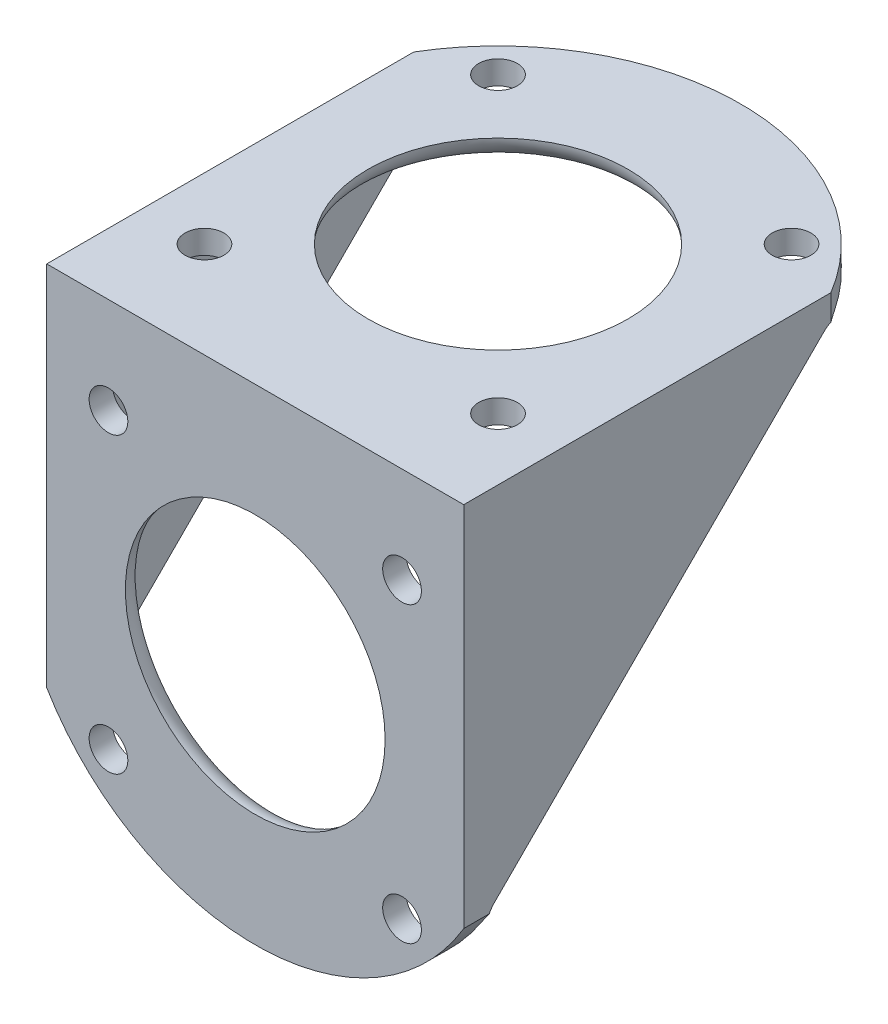
ISO-10303-21;
HEADER;
FILE_DESCRIPTION(('STEP AP214'),'2;1');
FILE_NAME('part.step','',(''),(''),'','','');
FILE_SCHEMA(('AUTOMOTIVE_DESIGN { 1 0 10303 214 1 1 1 1 }'));
ENDSEC;
DATA;
#1=APPLICATION_CONTEXT('core data for automotive mechanical design processes');
#2=APPLICATION_PROTOCOL_DEFINITION('international standard','automotive_design',2000,#1);
#3=PRODUCT_CONTEXT('',#1,'mechanical');
#4=PRODUCT('Part','Part','',(#3));
#5=PRODUCT_RELATED_PRODUCT_CATEGORY('part','',(#4));
#6=PRODUCT_DEFINITION_FORMATION('','',#4);
#7=PRODUCT_DEFINITION_CONTEXT('part definition',#1,'design');
#8=PRODUCT_DEFINITION('design','',#6,#7);
#9=PRODUCT_DEFINITION_SHAPE('','',#8);
#10=(LENGTH_UNIT() NAMED_UNIT(*) SI_UNIT(.MILLI.,.METRE.));
#11=(NAMED_UNIT(*) PLANE_ANGLE_UNIT() SI_UNIT($,.RADIAN.));
#12=(NAMED_UNIT(*) SI_UNIT($,.STERADIAN.) SOLID_ANGLE_UNIT());
#13=UNCERTAINTY_MEASURE_WITH_UNIT(LENGTH_MEASURE(1.E-05),#10,'distance_accuracy_value','');
#14=(GEOMETRIC_REPRESENTATION_CONTEXT(3) GLOBAL_UNCERTAINTY_ASSIGNED_CONTEXT((#13)) GLOBAL_UNIT_ASSIGNED_CONTEXT((#10,
#11,#12)) REPRESENTATION_CONTEXT('',''));
#15=CARTESIAN_POINT('',(0.,0.,0.));
#16=DIRECTION('',(0.,0.,1.));
#17=DIRECTION('',(1.,0.,0.));
#18=AXIS2_PLACEMENT_3D('',#15,#16,#17);
#19=CARTESIAN_POINT('',(0.,0.,0.));
#20=DIRECTION('',(0.,0.,1.));
#21=DIRECTION('',(1.,0.,0.));
#22=AXIS2_PLACEMENT_3D('',#19,#20,#21);
#23=PLANE('',#22);
#24=CARTESIAN_POINT('',(0.,0.,0.));
#25=DIRECTION('',(0.,0.,1.));
#26=DIRECTION('',(1.,0.,0.));
#27=AXIS2_PLACEMENT_3D('',#24,#25,#26);
#28=CIRCLE('',#27,13.07313);
#29=CARTESIAN_POINT('',(13.07313,0.,0.));
#30=VERTEX_POINT('',#29);
#31=EDGE_CURVE('E211',#30,#30,#28,.T.);
#32=ORIENTED_EDGE('',*,*,#31,.T.);
#33=EDGE_LOOP('',(#32));
#34=FACE_BOUND('',#33,.T.);
#35=CARTESIAN_POINT('',(-12.5157900270019,12.5157900270019,0.));
#36=DIRECTION('',(0.,0.,1.));
#37=DIRECTION('',(1.,0.,0.));
#38=AXIS2_PLACEMENT_3D('',#35,#36,#37);
#39=CIRCLE('',#38,1.651);
#40=CARTESIAN_POINT('',(-10.8647900270019,12.5157900270019,0.));
#41=VERTEX_POINT('',#40);
#42=EDGE_CURVE('E169',#41,#41,#39,.T.);
#43=ORIENTED_EDGE('',*,*,#42,.T.);
#44=EDGE_LOOP('',(#43));
#45=FACE_BOUND('',#44,.T.);
#46=CARTESIAN_POINT('',(12.5157900270019,-12.5157900270019,0.));
#47=DIRECTION('',(0.,0.,1.));
#48=DIRECTION('',(1.,0.,0.));
#49=AXIS2_PLACEMENT_3D('',#46,#47,#48);
#50=CIRCLE('',#49,1.651);
#51=CARTESIAN_POINT('',(14.1667900270019,-12.5157900270019,0.));
#52=VERTEX_POINT('',#51);
#53=EDGE_CURVE('E179',#52,#52,#50,.T.);
#54=ORIENTED_EDGE('',*,*,#53,.T.);
#55=EDGE_LOOP('',(#54));
#56=FACE_BOUND('',#55,.T.);
#57=CARTESIAN_POINT('',(-12.5157900270019,-12.5157900270019,0.));
#58=DIRECTION('',(0.,0.,1.));
#59=DIRECTION('',(1.,0.,0.));
#60=AXIS2_PLACEMENT_3D('',#57,#58,#59);
#61=CIRCLE('',#60,1.651);
#62=CARTESIAN_POINT('',(-10.8647900270019,-12.5157900270019,0.));
#63=VERTEX_POINT('',#62);
#64=EDGE_CURVE('E185',#63,#63,#61,.T.);
#65=ORIENTED_EDGE('',*,*,#64,.T.);
#66=EDGE_LOOP('',(#65));
#67=FACE_BOUND('',#66,.T.);
#68=CARTESIAN_POINT('',(12.5157900270019,12.5157900270019,0.));
#69=DIRECTION('',(0.,0.,1.));
#70=DIRECTION('',(1.,0.,0.));
#71=AXIS2_PLACEMENT_3D('',#68,#69,#70);
#72=CIRCLE('',#71,1.651);
#73=CARTESIAN_POINT('',(14.1667900270019,12.5157900270019,0.));
#74=VERTEX_POINT('',#73);
#75=EDGE_CURVE('E173',#74,#74,#72,.T.);
#76=ORIENTED_EDGE('',*,*,#75,.T.);
#77=EDGE_LOOP('',(#76));
#78=FACE_BOUND('',#77,.T.);
#79=DIRECTION('',(0.,1.,0.));
#80=VECTOR('',#79,1.);
#81=CARTESIAN_POINT('',(15.78,18.701,0.));
#82=LINE('',#81,#80);
#83=CARTESIAN_POINT('',(15.78,-11.4304552797739,0.));
#84=VERTEX_POINT('',#83);
#85=CARTESIAN_POINT('',(15.78,18.701,0.));
#86=VERTEX_POINT('',#85);
#87=EDGE_CURVE('E329',#84,#86,#82,.T.);
#88=ORIENTED_EDGE('',*,*,#87,.F.);
#89=DIRECTION('',(1.,0.,0.));
#90=VECTOR('',#89,1.);
#91=CARTESIAN_POINT('',(17.78,-11.4304552797739,0.));
#92=LINE('',#91,#90);
#93=CARTESIAN_POINT('',(17.2590872614136,-11.4304552797739,0.));
#94=VERTEX_POINT('',#93);
#95=EDGE_CURVE('E217',#84,#94,#92,.T.);
#96=ORIENTED_EDGE('',*,*,#95,.T.);
#97=CARTESIAN_POINT('',(0.,0.,0.));
#98=DIRECTION('',(0.,0.,1.));
#99=DIRECTION('',(1.,0.,0.));
#100=AXIS2_PLACEMENT_3D('',#97,#98,#99);
#101=CIRCLE('',#100,20.701);
#102=CARTESIAN_POINT('',(-17.2590872614136,-11.4304552797739,0.));
#103=VERTEX_POINT('',#102);
#104=EDGE_CURVE('E191',#103,#94,#101,.T.);
#105=ORIENTED_EDGE('',*,*,#104,.F.);
#106=DIRECTION('',(-1.,0.,0.));
#107=VECTOR('',#106,1.);
#108=CARTESIAN_POINT('',(0.,-11.4304552797739,0.));
#109=LINE('',#108,#107);
#110=CARTESIAN_POINT('',(-15.78,-11.4304552797739,0.));
#111=VERTEX_POINT('',#110);
#112=EDGE_CURVE('E214',#103,#111,#109,.F.);
#113=ORIENTED_EDGE('',*,*,#112,.T.);
#114=DIRECTION('',(0.,1.,0.));
#115=VECTOR('',#114,1.);
#116=CARTESIAN_POINT('',(-15.78,18.701,0.));
#117=LINE('',#116,#115);
#118=CARTESIAN_POINT('',(-15.78,18.701,0.));
#119=VERTEX_POINT('',#118);
#120=EDGE_CURVE('E312',#111,#119,#117,.T.);
#121=ORIENTED_EDGE('',*,*,#120,.T.);
#122=DIRECTION('',(-1.,0.,0.));
#123=VECTOR('',#122,1.);
#124=CARTESIAN_POINT('',(0.,18.701,0.));
#125=LINE('',#124,#123);
#126=EDGE_CURVE('E150',#86,#119,#125,.T.);
#127=ORIENTED_EDGE('',*,*,#126,.F.);
#128=EDGE_LOOP('',(#88,#96,#105,#113,#121,#127));
#129=FACE_BOUND('',#128,.T.);
#130=ADVANCED_FACE('F34',(#34,#45,#56,#67,#78,#129),#23,.F.);
#131=CARTESIAN_POINT('',(0.,18.7010000000001,-18.701));
#132=DIRECTION('',(0.,1.,0.));
#133=DIRECTION('',(1.,0.,0.));
#134=AXIS2_PLACEMENT_3D('',#131,#132,#133);
#135=PLANE('',#134);
#136=CARTESIAN_POINT('',(0.,18.7010000000001,-18.701));
#137=DIRECTION('',(0.,1.,0.));
#138=DIRECTION('',(0.,0.,1.));
#139=AXIS2_PLACEMENT_3D('',#136,#137,#138);
#140=CIRCLE('',#139,13.07313);
#141=CARTESIAN_POINT('',(0.,18.701,-5.62787000000001));
#142=VERTEX_POINT('',#141);
#143=EDGE_CURVE('E208',#142,#142,#140,.T.);
#144=ORIENTED_EDGE('',*,*,#143,.T.);
#145=EDGE_LOOP('',(#144));
#146=FACE_BOUND('',#145,.T.);
#147=CARTESIAN_POINT('',(-12.5157900270019,18.701,-6.18520997299813));
#148=DIRECTION('',(0.,-1.,0.));
#149=DIRECTION('',(1.,0.,0.));
#150=AXIS2_PLACEMENT_3D('',#147,#148,#149);
#151=CIRCLE('',#150,1.651);
#152=CARTESIAN_POINT('',(-10.8647900270019,18.701,-6.18520997299813));
#153=VERTEX_POINT('',#152);
#154=EDGE_CURVE('E349',#153,#153,#151,.T.);
#155=ORIENTED_EDGE('',*,*,#154,.F.);
#156=EDGE_LOOP('',(#155));
#157=FACE_BOUND('',#156,.T.);
#158=CARTESIAN_POINT('',(12.5157900270019,18.701,-6.18520997299813));
#159=DIRECTION('',(0.,-1.,0.));
#160=DIRECTION('',(1.,0.,0.));
#161=AXIS2_PLACEMENT_3D('',#158,#159,#160);
#162=CIRCLE('',#161,1.651);
#163=CARTESIAN_POINT('',(14.1667900270019,18.701,-6.18520997299813));
#164=VERTEX_POINT('',#163);
#165=EDGE_CURVE('E353',#164,#164,#162,.T.);
#166=ORIENTED_EDGE('',*,*,#165,.F.);
#167=EDGE_LOOP('',(#166));
#168=FACE_BOUND('',#167,.T.);
#169=CARTESIAN_POINT('',(12.5157900270019,18.7010000000001,-31.2167900270019));
#170=DIRECTION('',(0.,-1.,0.));
#171=DIRECTION('',(1.,0.,0.));
#172=AXIS2_PLACEMENT_3D('',#169,#170,#171);
#173=CIRCLE('',#172,1.651);
#174=CARTESIAN_POINT('',(14.1667900270019,18.7010000000001,-31.2167900270019));
#175=VERTEX_POINT('',#174);
#176=EDGE_CURVE('E359',#175,#175,#173,.T.);
#177=ORIENTED_EDGE('',*,*,#176,.F.);
#178=EDGE_LOOP('',(#177));
#179=FACE_BOUND('',#178,.T.);
#180=CARTESIAN_POINT('',(-12.5157900270019,18.7010000000001,-31.2167900270019));
#181=DIRECTION('',(0.,-1.,0.));
#182=DIRECTION('',(1.,0.,0.));
#183=AXIS2_PLACEMENT_3D('',#180,#181,#182);
#184=CIRCLE('',#183,1.651);
#185=CARTESIAN_POINT('',(-10.8647900270019,18.7010000000001,-31.2167900270019));
#186=VERTEX_POINT('',#185);
#187=EDGE_CURVE('E162',#186,#186,#184,.T.);
#188=ORIENTED_EDGE('',*,*,#187,.F.);
#189=EDGE_LOOP('',(#188));
#190=FACE_BOUND('',#189,.T.);
#191=DIRECTION('',(0.,0.,-1.));
#192=VECTOR('',#191,1.);
#193=CARTESIAN_POINT('',(-15.78,18.701,-29.3030281550277));
#194=LINE('',#193,#192);
#195=CARTESIAN_POINT('',(-15.78,18.701,-30.131455279774));
#196=VERTEX_POINT('',#195);
#197=EDGE_CURVE('E317',#119,#196,#194,.T.);
#198=ORIENTED_EDGE('',*,*,#197,.T.);
#199=DIRECTION('',(-1.,0.,0.));
#200=VECTOR('',#199,1.);
#201=CARTESIAN_POINT('',(0.,18.7010000000001,-30.131455279774));
#202=LINE('',#201,#200);
#203=CARTESIAN_POINT('',(-17.2590872614135,18.7010000000001,-30.131455279774));
#204=VERTEX_POINT('',#203);
#205=EDGE_CURVE('E233',#196,#204,#202,.T.);
#206=ORIENTED_EDGE('',*,*,#205,.T.);
#207=CARTESIAN_POINT('',(0.,18.7010000000001,-18.701));
#208=DIRECTION('',(0.,-1.,0.));
#209=DIRECTION('',(1.,0.,0.));
#210=AXIS2_PLACEMENT_3D('',#207,#208,#209);
#211=CIRCLE('',#210,20.701);
#212=CARTESIAN_POINT('',(17.2590872614135,18.7010000000001,-30.131455279774));
#213=VERTEX_POINT('',#212);
#214=EDGE_CURVE('E155',#204,#213,#211,.T.);
#215=ORIENTED_EDGE('',*,*,#214,.T.);
#216=DIRECTION('',(1.,0.,0.));
#217=VECTOR('',#216,1.);
#218=CARTESIAN_POINT('',(15.78,18.7010000000001,-30.131455279774));
#219=LINE('',#218,#217);
#220=CARTESIAN_POINT('',(15.78,18.701,-30.131455279774));
#221=VERTEX_POINT('',#220);
#222=EDGE_CURVE('E230',#213,#221,#219,.F.);
#223=ORIENTED_EDGE('',*,*,#222,.T.);
#224=DIRECTION('',(0.,0.,-1.));
#225=VECTOR('',#224,1.);
#226=CARTESIAN_POINT('',(15.78,18.701,-29.3030281550277));
#227=LINE('',#226,#225);
#228=EDGE_CURVE('E313',#86,#221,#227,.T.);
#229=ORIENTED_EDGE('',*,*,#228,.F.);
#230=ORIENTED_EDGE('',*,*,#126,.T.);
#231=EDGE_LOOP('',(#198,#206,#215,#223,#229,#230));
#232=FACE_BOUND('',#231,.T.);
#233=ADVANCED_FACE('F286',(#146,#157,#168,#179,#190,#232),#135,.F.);
#234=CARTESIAN_POINT('',(0.,0.,2.));
#235=DIRECTION('',(0.,0.,1.));
#236=DIRECTION('',(1.,0.,0.));
#237=AXIS2_PLACEMENT_3D('',#234,#235,#236);
#238=PLANE('',#237);
#239=DIRECTION('',(0.,-1.,0.));
#240=VECTOR('',#239,1.);
#241=CARTESIAN_POINT('',(-17.78,-10.6020281550277,2.));
#242=LINE('',#241,#240);
#243=CARTESIAN_POINT('',(-17.78,20.701,2.));
#244=VERTEX_POINT('',#243);
#245=CARTESIAN_POINT('',(-17.78,-10.6020281550277,2.));
#246=VERTEX_POINT('',#245);
#247=EDGE_CURVE('E138',#244,#246,#242,.T.);
#248=ORIENTED_EDGE('',*,*,#247,.T.);
#249=CARTESIAN_POINT('',(0.,0.,2.));
#250=DIRECTION('',(0.,0.,1.));
#251=DIRECTION('',(1.,0.,0.));
#252=AXIS2_PLACEMENT_3D('',#249,#250,#251);
#253=CIRCLE('',#252,20.701);
#254=CARTESIAN_POINT('',(17.78,-10.6020281550277,2.));
#255=VERTEX_POINT('',#254);
#256=EDGE_CURVE('E194',#246,#255,#253,.T.);
#257=ORIENTED_EDGE('',*,*,#256,.T.);
#258=DIRECTION('',(0.,1.,0.));
#259=VECTOR('',#258,1.);
#260=CARTESIAN_POINT('',(17.78,-10.6020281550277,2.));
#261=LINE('',#260,#259);
#262=CARTESIAN_POINT('',(17.78,20.701,2.));
#263=VERTEX_POINT('',#262);
#264=EDGE_CURVE('E197',#255,#263,#261,.T.);
#265=ORIENTED_EDGE('',*,*,#264,.T.);
#266=DIRECTION('',(-1.,0.,0.));
#267=VECTOR('',#266,1.);
#268=CARTESIAN_POINT('',(-17.78,20.701,2.));
#269=LINE('',#268,#267);
#270=EDGE_CURVE('E199',#263,#244,#269,.T.);
#271=ORIENTED_EDGE('',*,*,#270,.T.);
#272=EDGE_LOOP('',(#248,#257,#265,#271));
#273=FACE_BOUND('',#272,.T.);
#274=CARTESIAN_POINT('',(0.,0.,2.));
#275=DIRECTION('',(0.,0.,1.));
#276=DIRECTION('',(1.,0.,0.));
#277=AXIS2_PLACEMENT_3D('',#274,#275,#276);
#278=CIRCLE('',#277,11.07313);
#279=CARTESIAN_POINT('',(11.07313,0.,2.));
#280=VERTEX_POINT('',#279);
#281=EDGE_CURVE('E166',#280,#280,#278,.T.);
#282=ORIENTED_EDGE('',*,*,#281,.F.);
#283=EDGE_LOOP('',(#282));
#284=FACE_BOUND('',#283,.T.);
#285=CARTESIAN_POINT('',(12.5157900270019,12.5157900270019,2.));
#286=DIRECTION('',(0.,0.,1.));
#287=DIRECTION('',(1.,0.,0.));
#288=AXIS2_PLACEMENT_3D('',#285,#286,#287);
#289=CIRCLE('',#288,1.651);
#290=CARTESIAN_POINT('',(14.1667900270019,12.5157900270019,2.));
#291=VERTEX_POINT('',#290);
#292=EDGE_CURVE('E176',#291,#291,#289,.T.);
#293=ORIENTED_EDGE('',*,*,#292,.F.);
#294=EDGE_LOOP('',(#293));
#295=FACE_BOUND('',#294,.T.);
#296=CARTESIAN_POINT('',(-12.5157900270019,-12.5157900270019,2.));
#297=DIRECTION('',(0.,0.,1.));
#298=DIRECTION('',(1.,0.,0.));
#299=AXIS2_PLACEMENT_3D('',#296,#297,#298);
#300=CIRCLE('',#299,1.651);
#301=CARTESIAN_POINT('',(-10.8647900270019,-12.5157900270019,2.));
#302=VERTEX_POINT('',#301);
#303=EDGE_CURVE('E188',#302,#302,#300,.T.);
#304=ORIENTED_EDGE('',*,*,#303,.F.);
#305=EDGE_LOOP('',(#304));
#306=FACE_BOUND('',#305,.T.);
#307=CARTESIAN_POINT('',(12.5157900270019,-12.5157900270019,2.));
#308=DIRECTION('',(0.,0.,1.));
#309=DIRECTION('',(1.,0.,0.));
#310=AXIS2_PLACEMENT_3D('',#307,#308,#309);
#311=CIRCLE('',#310,1.651);
#312=CARTESIAN_POINT('',(14.1667900270019,-12.5157900270019,2.));
#313=VERTEX_POINT('',#312);
#314=EDGE_CURVE('E182',#313,#313,#311,.T.);
#315=ORIENTED_EDGE('',*,*,#314,.F.);
#316=EDGE_LOOP('',(#315));
#317=FACE_BOUND('',#316,.T.);
#318=CARTESIAN_POINT('',(-12.5157900270019,12.5157900270019,2.));
#319=DIRECTION('',(0.,0.,1.));
#320=DIRECTION('',(1.,0.,0.));
#321=AXIS2_PLACEMENT_3D('',#318,#319,#320);
#322=CIRCLE('',#321,1.651);
#323=CARTESIAN_POINT('',(-10.8647900270019,12.5157900270019,2.));
#324=VERTEX_POINT('',#323);
#325=EDGE_CURVE('E170',#324,#324,#322,.T.);
#326=ORIENTED_EDGE('',*,*,#325,.F.);
#327=EDGE_LOOP('',(#326));
#328=FACE_BOUND('',#327,.T.);
#329=ADVANCED_FACE('F373',(#273,#284,#295,#306,#317,#328),#238,.T.);
#330=CARTESIAN_POINT('',(0.,0.,2.));
#331=DIRECTION('',(0.,0.,-1.));
#332=DIRECTION('',(-1.,0.,0.));
#333=AXIS2_PLACEMENT_3D('',#330,#331,#332);
#334=CYLINDRICAL_SURFACE('',#333,20.701);
#335=DIRECTION('',(0.,0.,-1.));
#336=VECTOR('',#335,1.);
#337=CARTESIAN_POINT('',(-17.78,-10.6020281550277,2.));
#338=LINE('',#337,#336);
#339=CARTESIAN_POINT('',(-17.78,-10.6020281550277,-0.179640557751042));
#340=VERTEX_POINT('',#339);
#341=EDGE_CURVE('E143',#246,#340,#338,.T.);
#342=ORIENTED_EDGE('',*,*,#341,.T.);
#343=CARTESIAN_POINT('',(-17.78,-10.6020281550277,-0.179640557751042));
#344=CARTESIAN_POINT('',(-17.7400354785017,-10.6690622681182,-0.149131957703332));
#345=CARTESIAN_POINT('',(-17.6989048503171,-10.7371662716334,-0.122608663377549));
#346=CARTESIAN_POINT('',(-17.6150601486681,-10.8741613546494,-0.0775830581767141));
#347=CARTESIAN_POINT('',(-17.5723629440587,-10.9430404492039,-0.0590130390403743));
#348=CARTESIAN_POINT('',(-17.4854329356753,-11.0814130526126,-0.0294221091678858));
#349=CARTESIAN_POINT('',(-17.4412003847321,-11.1509064589145,-0.0183999616362635));
#350=CARTESIAN_POINT('',(-17.3511552063969,-11.2905194743294,-0.00365672627516723));
#351=CARTESIAN_POINT('',(-17.3053321274247,-11.3606392329797,-4.82605942087882E-07));
#352=CARTESIAN_POINT('',(-17.2590872614136,-11.4304552797739,0.));
#353=B_SPLINE_CURVE_WITH_KNOTS('',3,(#343,#344,#345,#346,#347,#348,#349,#350,#351,#352),
.UNSPECIFIED.,.F.,.F.,(4,2,2,2,4),(0.,0.251218402435054,0.50025342283884,0.74924762655276,
1.0004243838379),.UNSPECIFIED.);
#354=EDGE_CURVE('E264',#340,#103,#353,.T.);
#355=ORIENTED_EDGE('',*,*,#354,.T.);
#356=ORIENTED_EDGE('',*,*,#104,.T.);
#357=CARTESIAN_POINT('',(17.2590872614136,-11.4304552797739,0.));
#358=CARTESIAN_POINT('',(17.3053321274247,-11.3606392329797,-4.82605940739046E-07));
#359=CARTESIAN_POINT('',(17.3511552063969,-11.2905194743294,-0.00365672627516656));
#360=CARTESIAN_POINT('',(17.4412003847321,-11.1509064589145,-0.0183999616362646));
#361=CARTESIAN_POINT('',(17.4854329356753,-11.0814130526126,-0.0294221091678879));
#362=CARTESIAN_POINT('',(17.5723629440587,-10.9430404492039,-0.059013039040375));
#363=CARTESIAN_POINT('',(17.6150601486681,-10.8741613546494,-0.0775830581767127));
#364=CARTESIAN_POINT('',(17.6989048503171,-10.7371662716334,-0.122608663377557));
#365=CARTESIAN_POINT('',(17.7400354785017,-10.6690622681182,-0.149131957703352));
#366=CARTESIAN_POINT('',(17.78,-10.6020281550277,-0.17964055775109));
#367=B_SPLINE_CURVE_WITH_KNOTS('',3,(#357,#358,#359,#360,#361,#362,#363,#364,#365,#366),
.UNSPECIFIED.,.F.,.F.,(4,2,2,2,4),(0.,0.251176757285138,0.500170960999061,0.749205981402852,
1.00042438383791),.UNSPECIFIED.);
#368=CARTESIAN_POINT('',(17.78,-10.6020281550277,-0.179640557751042));
#369=VERTEX_POINT('',#368);
#370=EDGE_CURVE('E236',#94,#369,#367,.T.);
#371=ORIENTED_EDGE('',*,*,#370,.T.);
#372=DIRECTION('',(0.,0.,-1.));
#373=VECTOR('',#372,1.);
#374=CARTESIAN_POINT('',(17.78,-10.6020281550277,2.));
#375=LINE('',#374,#373);
#376=EDGE_CURVE('E206',#255,#369,#375,.T.);
#377=ORIENTED_EDGE('',*,*,#376,.F.);
#378=ORIENTED_EDGE('',*,*,#256,.F.);
#379=EDGE_LOOP('',(#342,#355,#356,#371,#377,#378));
#380=FACE_BOUND('',#379,.T.);
#381=ADVANCED_FACE('F246',(#380),#334,.T.);
#382=CARTESIAN_POINT('',(17.78,-10.6020281550277,2.));
#383=DIRECTION('',(-1.,0.,0.));
#384=DIRECTION('',(0.,0.,1.));
#385=AXIS2_PLACEMENT_3D('',#382,#383,#384);
#386=PLANE('',#385);
#387=DIRECTION('',(0.,0.,-1.));
#388=VECTOR('',#387,1.);
#389=CARTESIAN_POINT('',(17.78,20.701,2.));
#390=LINE('',#389,#388);
#391=CARTESIAN_POINT('',(17.78,20.7010000000001,-29.3030281550277));
#392=VERTEX_POINT('',#391);
#393=EDGE_CURVE('E142',#263,#392,#390,.T.);
#394=ORIENTED_EDGE('',*,*,#393,.F.);
#395=ORIENTED_EDGE('',*,*,#264,.F.);
#396=ORIENTED_EDGE('',*,*,#376,.T.);
#397=CARTESIAN_POINT('',(17.78,-11.4304552797739,-2.));
#398=DIRECTION('',(-1.,0.,0.));
#399=DIRECTION('',(0.,0.,1.));
#400=AXIS2_PLACEMENT_3D('',#397,#398,#399);
#401=CIRCLE('',#400,2.);
#402=CARTESIAN_POINT('',(17.78,-10.0162417174008,-0.585786437626905));
#403=VERTEX_POINT('',#402);
#404=EDGE_CURVE('E244',#369,#403,#401,.T.);
#405=ORIENTED_EDGE('',*,*,#404,.T.);
#406=DIRECTION('',(0.,-0.707106781186547,0.707106781186548));
#407=VECTOR('',#406,1.);
#408=CARTESIAN_POINT('',(17.78,-10.6020281550277,0.));
#409=LINE('',#408,#407);
#410=CARTESIAN_POINT('',(17.78,18.1152135623732,-28.7172417174009));
#411=VERTEX_POINT('',#410);
#412=EDGE_CURVE('E336',#411,#403,#409,.T.);
#413=ORIENTED_EDGE('',*,*,#412,.F.);
#414=CARTESIAN_POINT('',(17.78,16.7010000000001,-30.131455279774));
#415=DIRECTION('',(-1.,0.,0.));
#416=DIRECTION('',(0.,0.,1.));
#417=AXIS2_PLACEMENT_3D('',#414,#415,#416);
#418=CIRCLE('',#417,2.);
#419=CARTESIAN_POINT('',(17.78,18.521359442249,-29.3030281550277));
#420=VERTEX_POINT('',#419);
#421=EDGE_CURVE('E294',#411,#420,#418,.T.);
#422=ORIENTED_EDGE('',*,*,#421,.T.);
#423=DIRECTION('',(0.,-1.,0.));
#424=VECTOR('',#423,1.);
#425=CARTESIAN_POINT('',(17.78,20.7010000000001,-29.3030281550277));
#426=LINE('',#425,#424);
#427=EDGE_CURVE('E50',#392,#420,#426,.T.);
#428=ORIENTED_EDGE('',*,*,#427,.F.);
#429=EDGE_LOOP('',(#394,#395,#396,#405,#413,#422,#428));
#430=FACE_BOUND('',#429,.T.);
#431=ADVANCED_FACE('F432',(#430),#386,.F.);
#432=CARTESIAN_POINT('',(-17.78,20.701,2.));
#433=DIRECTION('',(0.,-1.,0.));
#434=DIRECTION('',(0.,0.,-1.));
#435=AXIS2_PLACEMENT_3D('',#432,#433,#434);
#436=PLANE('',#435);
#437=ORIENTED_EDGE('',*,*,#393,.T.);
#438=CARTESIAN_POINT('',(0.,20.7010000000001,-18.701));
#439=DIRECTION('',(0.,-1.,0.));
#440=DIRECTION('',(1.,0.,0.));
#441=AXIS2_PLACEMENT_3D('',#438,#439,#440);
#442=CIRCLE('',#441,20.701);
#443=CARTESIAN_POINT('',(-17.78,20.7010000000001,-29.3030281550277));
#444=VERTEX_POINT('',#443);
#445=EDGE_CURVE('E147',#444,#392,#442,.T.);
#446=ORIENTED_EDGE('',*,*,#445,.F.);
#447=DIRECTION('',(0.,0.,-1.));
#448=VECTOR('',#447,1.);
#449=CARTESIAN_POINT('',(-17.78,20.701,2.));
#450=LINE('',#449,#448);
#451=EDGE_CURVE('E135',#244,#444,#450,.T.);
#452=ORIENTED_EDGE('',*,*,#451,.F.);
#453=ORIENTED_EDGE('',*,*,#270,.F.);
#454=EDGE_LOOP('',(#437,#446,#452,#453));
#455=FACE_BOUND('',#454,.T.);
#456=CARTESIAN_POINT('',(-12.5157900270019,20.7010000000001,-31.2167900270019));
#457=DIRECTION('',(0.,-1.,0.));
#458=DIRECTION('',(1.,0.,0.));
#459=AXIS2_PLACEMENT_3D('',#456,#457,#458);
#460=CIRCLE('',#459,1.651);
#461=CARTESIAN_POINT('',(-10.8647900270019,20.7010000000001,-31.2167900270019));
#462=VERTEX_POINT('',#461);
#463=EDGE_CURVE('E159',#462,#462,#460,.T.);
#464=ORIENTED_EDGE('',*,*,#463,.T.);
#465=EDGE_LOOP('',(#464));
#466=FACE_BOUND('',#465,.T.);
#467=CARTESIAN_POINT('',(12.5157900270019,20.7010000000001,-31.2167900270019));
#468=DIRECTION('',(0.,-1.,0.));
#469=DIRECTION('',(1.,0.,0.));
#470=AXIS2_PLACEMENT_3D('',#467,#468,#469);
#471=CIRCLE('',#470,1.651);
#472=CARTESIAN_POINT('',(14.1667900270019,20.7010000000001,-31.2167900270019));
#473=VERTEX_POINT('',#472);
#474=EDGE_CURVE('E362',#473,#473,#471,.T.);
#475=ORIENTED_EDGE('',*,*,#474,.T.);
#476=EDGE_LOOP('',(#475));
#477=FACE_BOUND('',#476,.T.);
#478=CARTESIAN_POINT('',(12.5157900270019,20.701,-6.18520997299812));
#479=DIRECTION('',(0.,-1.,0.));
#480=DIRECTION('',(1.,0.,0.));
#481=AXIS2_PLACEMENT_3D('',#478,#479,#480);
#482=CIRCLE('',#481,1.651);
#483=CARTESIAN_POINT('',(14.1667900270019,20.701,-6.18520997299812));
#484=VERTEX_POINT('',#483);
#485=EDGE_CURVE('E356',#484,#484,#482,.T.);
#486=ORIENTED_EDGE('',*,*,#485,.T.);
#487=EDGE_LOOP('',(#486));
#488=FACE_BOUND('',#487,.T.);
#489=CARTESIAN_POINT('',(-12.5157900270019,20.701,-6.18520997299812));
#490=DIRECTION('',(0.,-1.,0.));
#491=DIRECTION('',(1.,0.,0.));
#492=AXIS2_PLACEMENT_3D('',#489,#490,#491);
#493=CIRCLE('',#492,1.651);
#494=CARTESIAN_POINT('',(-10.8647900270019,20.701,-6.18520997299812));
#495=VERTEX_POINT('',#494);
#496=EDGE_CURVE('E350',#495,#495,#493,.T.);
#497=ORIENTED_EDGE('',*,*,#496,.T.);
#498=EDGE_LOOP('',(#497));
#499=FACE_BOUND('',#498,.T.);
#500=CARTESIAN_POINT('',(0.,20.7010000000001,-18.701));
#501=DIRECTION('',(0.,-1.,0.));
#502=DIRECTION('',(1.,0.,0.));
#503=AXIS2_PLACEMENT_3D('',#500,#501,#502);
#504=CIRCLE('',#503,11.07313);
#505=CARTESIAN_POINT('',(11.07313,20.7010000000001,-18.701));
#506=VERTEX_POINT('',#505);
#507=EDGE_CURVE('E345',#506,#506,#504,.T.);
#508=ORIENTED_EDGE('',*,*,#507,.T.);
#509=EDGE_LOOP('',(#508));
#510=FACE_BOUND('',#509,.T.);
#511=ADVANCED_FACE('F152',(#455,#466,#477,#488,#499,#510),#436,.F.);
#512=CARTESIAN_POINT('',(-17.78,-10.6020281550277,2.));
#513=DIRECTION('',(1.,0.,0.));
#514=DIRECTION('',(0.,0.,-1.));
#515=AXIS2_PLACEMENT_3D('',#512,#513,#514);
#516=PLANE('',#515);
#517=DIRECTION('',(0.,-1.,0.));
#518=VECTOR('',#517,1.);
#519=CARTESIAN_POINT('',(-17.78,20.7010000000001,-29.3030281550277));
#520=LINE('',#519,#518);
#521=CARTESIAN_POINT('',(-17.78,18.521359442249,-29.3030281550277));
#522=VERTEX_POINT('',#521);
#523=EDGE_CURVE('E58',#444,#522,#520,.T.);
#524=ORIENTED_EDGE('',*,*,#523,.T.);
#525=CARTESIAN_POINT('',(-17.78,16.7010000000001,-30.131455279774));
#526=DIRECTION('',(1.,0.,0.));
#527=DIRECTION('',(0.,0.,-1.));
#528=AXIS2_PLACEMENT_3D('',#525,#526,#527);
#529=CIRCLE('',#528,2.);
#530=CARTESIAN_POINT('',(-17.78,18.1152135623732,-28.7172417174009));
#531=VERTEX_POINT('',#530);
#532=EDGE_CURVE('E278',#522,#531,#529,.T.);
#533=ORIENTED_EDGE('',*,*,#532,.T.);
#534=DIRECTION('',(0.,-0.707106781186547,0.707106781186548));
#535=VECTOR('',#534,1.);
#536=CARTESIAN_POINT('',(-17.78,-10.6020281550277,0.));
#537=LINE('',#536,#535);
#538=CARTESIAN_POINT('',(-17.78,-10.0162417174008,-0.585786437626905));
#539=VERTEX_POINT('',#538);
#540=EDGE_CURVE('E305',#531,#539,#537,.T.);
#541=ORIENTED_EDGE('',*,*,#540,.T.);
#542=CARTESIAN_POINT('',(-17.78,-11.4304552797739,-2.));
#543=DIRECTION('',(1.,0.,0.));
#544=DIRECTION('',(0.,0.,-1.));
#545=AXIS2_PLACEMENT_3D('',#542,#543,#544);
#546=CIRCLE('',#545,2.);
#547=EDGE_CURVE('E271',#539,#340,#546,.T.);
#548=ORIENTED_EDGE('',*,*,#547,.T.);
#549=ORIENTED_EDGE('',*,*,#341,.F.);
#550=ORIENTED_EDGE('',*,*,#247,.F.);
#551=ORIENTED_EDGE('',*,*,#451,.T.);
#552=EDGE_LOOP('',(#524,#533,#541,#548,#549,#550,#551));
#553=FACE_BOUND('',#552,.T.);
#554=ADVANCED_FACE('F136',(#553),#516,.F.);
#555=CARTESIAN_POINT('',(-12.5157900270019,-12.5157900270019,2.));
#556=DIRECTION('',(0.,0.,-1.));
#557=DIRECTION('',(-1.,0.,0.));
#558=AXIS2_PLACEMENT_3D('',#555,#556,#557);
#559=CYLINDRICAL_SURFACE('',#558,1.651);
#560=ORIENTED_EDGE('',*,*,#303,.T.);
#561=EDGE_LOOP('',(#560));
#562=FACE_BOUND('',#561,.T.);
#563=ORIENTED_EDGE('',*,*,#64,.F.);
#564=EDGE_LOOP('',(#563));
#565=FACE_BOUND('',#564,.T.);
#566=ADVANCED_FACE('F438',(#562,#565),#559,.F.);
#567=CARTESIAN_POINT('',(12.5157900270019,-12.5157900270019,2.));
#568=DIRECTION('',(0.,0.,-1.));
#569=DIRECTION('',(-1.,0.,0.));
#570=AXIS2_PLACEMENT_3D('',#567,#568,#569);
#571=CYLINDRICAL_SURFACE('',#570,1.651);
#572=ORIENTED_EDGE('',*,*,#314,.T.);
#573=EDGE_LOOP('',(#572));
#574=FACE_BOUND('',#573,.T.);
#575=ORIENTED_EDGE('',*,*,#53,.F.);
#576=EDGE_LOOP('',(#575));
#577=FACE_BOUND('',#576,.T.);
#578=ADVANCED_FACE('F444',(#574,#577),#571,.F.);
#579=CARTESIAN_POINT('',(12.5157900270019,12.5157900270019,2.));
#580=DIRECTION('',(0.,0.,-1.));
#581=DIRECTION('',(-1.,0.,0.));
#582=AXIS2_PLACEMENT_3D('',#579,#580,#581);
#583=CYLINDRICAL_SURFACE('',#582,1.651);
#584=ORIENTED_EDGE('',*,*,#292,.T.);
#585=EDGE_LOOP('',(#584));
#586=FACE_BOUND('',#585,.T.);
#587=ORIENTED_EDGE('',*,*,#75,.F.);
#588=EDGE_LOOP('',(#587));
#589=FACE_BOUND('',#588,.T.);
#590=ADVANCED_FACE('F447',(#586,#589),#583,.F.);
#591=CARTESIAN_POINT('',(-12.5157900270019,12.5157900270019,2.));
#592=DIRECTION('',(0.,0.,-1.));
#593=DIRECTION('',(-1.,0.,0.));
#594=AXIS2_PLACEMENT_3D('',#591,#592,#593);
#595=CYLINDRICAL_SURFACE('',#594,1.651);
#596=ORIENTED_EDGE('',*,*,#325,.T.);
#597=EDGE_LOOP('',(#596));
#598=FACE_BOUND('',#597,.T.);
#599=ORIENTED_EDGE('',*,*,#42,.F.);
#600=EDGE_LOOP('',(#599));
#601=FACE_BOUND('',#600,.T.);
#602=ADVANCED_FACE('F285',(#598,#601),#595,.F.);
#603=CARTESIAN_POINT('',(0.,20.7010000000001,-18.701));
#604=DIRECTION('',(0.,-1.,0.));
#605=DIRECTION('',(0.,0.,-1.));
#606=AXIS2_PLACEMENT_3D('',#603,#604,#605);
#607=CYLINDRICAL_SURFACE('',#606,20.701);
#608=ORIENTED_EDGE('',*,*,#214,.F.);
#609=CARTESIAN_POINT('',(-17.2590872614135,18.7010000000001,-30.131455279774));
#610=CARTESIAN_POINT('',(-17.3053321274246,18.7009995173942,-30.0616392329799));
#611=CARTESIAN_POINT('',(-17.3511552063969,18.6973432737249,-29.9915194743295));
#612=CARTESIAN_POINT('',(-17.4412003847321,18.6826000383638,-29.8519064589146));
#613=CARTESIAN_POINT('',(-17.4854329356752,18.6715778908322,-29.7824130526127));
#614=CARTESIAN_POINT('',(-17.5723629440586,18.6419869609597,-29.6440404492039));
#615=CARTESIAN_POINT('',(-17.6150601486681,18.6234169418234,-29.5751613546494));
#616=CARTESIAN_POINT('',(-17.6989048503171,18.5783913366225,-29.4381662716334));
#617=CARTESIAN_POINT('',(-17.7400354785017,18.5518680422967,-29.3700622681182));
#618=CARTESIAN_POINT('',(-17.78,18.521359442249,-29.3030281550277));
#619=B_SPLINE_CURVE_WITH_KNOTS('',3,(#609,#610,#611,#612,#613,#614,#615,#616,#617,#618),
.UNSPECIFIED.,.F.,.F.,(4,2,2,2,4),(0.,0.25117675728517,0.500170960999135,0.749205981402961,
1.00042438383805),.UNSPECIFIED.);
#620=EDGE_CURVE('E148',#204,#522,#619,.T.);
#621=ORIENTED_EDGE('',*,*,#620,.T.);
#622=ORIENTED_EDGE('',*,*,#523,.F.);
#623=ORIENTED_EDGE('',*,*,#445,.T.);
#624=ORIENTED_EDGE('',*,*,#427,.T.);
#625=CARTESIAN_POINT('',(17.78,18.521359442249,-29.3030281550277));
#626=CARTESIAN_POINT('',(17.7400354785017,18.5518680422967,-29.3700622681182));
#627=CARTESIAN_POINT('',(17.6989048503171,18.5783913366225,-29.4381662716334));
#628=CARTESIAN_POINT('',(17.6150601486681,18.6234169418234,-29.5751613546494));
#629=CARTESIAN_POINT('',(17.5723629440586,18.6419869609597,-29.6440404492039));
#630=CARTESIAN_POINT('',(17.4854329356752,18.6715778908322,-29.7824130526127));
#631=CARTESIAN_POINT('',(17.4412003847321,18.6826000383638,-29.8519064589146));
#632=CARTESIAN_POINT('',(17.3511552063969,18.6973432737249,-29.9915194743295));
#633=CARTESIAN_POINT('',(17.3053321274246,18.7009995173942,-30.0616392329799));
#634=CARTESIAN_POINT('',(17.2590872614135,18.7010000000001,-30.131455279774));
#635=B_SPLINE_CURVE_WITH_KNOTS('',3,(#625,#626,#627,#628,#629,#630,#631,#632,#633,#634),
.UNSPECIFIED.,.F.,.F.,(4,2,2,2,4),(0.,0.251218402435086,0.500253422838903,0.749247626552861,
1.00042438383803),.UNSPECIFIED.);
#636=EDGE_CURVE('E43',#420,#213,#635,.T.);
#637=ORIENTED_EDGE('',*,*,#636,.T.);
#638=EDGE_LOOP('',(#608,#621,#622,#623,#624,#637));
#639=FACE_BOUND('',#638,.T.);
#640=ADVANCED_FACE('F146',(#639),#607,.T.);
#641=CARTESIAN_POINT('',(-12.5157900270019,20.7010000000001,-31.2167900270019));
#642=DIRECTION('',(0.,-1.,0.));
#643=DIRECTION('',(0.,0.,-1.));
#644=AXIS2_PLACEMENT_3D('',#641,#642,#643);
#645=CYLINDRICAL_SURFACE('',#644,1.651);
#646=ORIENTED_EDGE('',*,*,#463,.F.);
#647=EDGE_LOOP('',(#646));
#648=FACE_BOUND('',#647,.T.);
#649=ORIENTED_EDGE('',*,*,#187,.T.);
#650=EDGE_LOOP('',(#649));
#651=FACE_BOUND('',#650,.T.);
#652=ADVANCED_FACE('F284',(#648,#651),#645,.F.);
#653=CARTESIAN_POINT('',(12.5157900270019,20.7010000000001,-31.2167900270019));
#654=DIRECTION('',(0.,-1.,0.));
#655=DIRECTION('',(0.,0.,-1.));
#656=AXIS2_PLACEMENT_3D('',#653,#654,#655);
#657=CYLINDRICAL_SURFACE('',#656,1.651);
#658=ORIENTED_EDGE('',*,*,#474,.F.);
#659=EDGE_LOOP('',(#658));
#660=FACE_BOUND('',#659,.T.);
#661=ORIENTED_EDGE('',*,*,#176,.T.);
#662=EDGE_LOOP('',(#661));
#663=FACE_BOUND('',#662,.T.);
#664=ADVANCED_FACE('F391',(#660,#663),#657,.F.);
#665=CARTESIAN_POINT('',(12.5157900270019,20.701,-6.18520997299812));
#666=DIRECTION('',(0.,-1.,0.));
#667=DIRECTION('',(0.,0.,-1.));
#668=AXIS2_PLACEMENT_3D('',#665,#666,#667);
#669=CYLINDRICAL_SURFACE('',#668,1.651);
#670=ORIENTED_EDGE('',*,*,#485,.F.);
#671=EDGE_LOOP('',(#670));
#672=FACE_BOUND('',#671,.T.);
#673=ORIENTED_EDGE('',*,*,#165,.T.);
#674=EDGE_LOOP('',(#673));
#675=FACE_BOUND('',#674,.T.);
#676=ADVANCED_FACE('F393',(#672,#675),#669,.F.);
#677=CARTESIAN_POINT('',(-12.5157900270019,20.701,-6.18520997299812));
#678=DIRECTION('',(0.,-1.,0.));
#679=DIRECTION('',(0.,0.,-1.));
#680=AXIS2_PLACEMENT_3D('',#677,#678,#679);
#681=CYLINDRICAL_SURFACE('',#680,1.651);
#682=ORIENTED_EDGE('',*,*,#496,.F.);
#683=EDGE_LOOP('',(#682));
#684=FACE_BOUND('',#683,.T.);
#685=ORIENTED_EDGE('',*,*,#154,.T.);
#686=EDGE_LOOP('',(#685));
#687=FACE_BOUND('',#686,.T.);
#688=ADVANCED_FACE('F400',(#684,#687),#681,.F.);
#689=CARTESIAN_POINT('',(-15.78,-10.6020281550277,0.));
#690=DIRECTION('',(0.,-0.707106781186548,-0.707106781186547));
#691=DIRECTION('',(0.,0.707106781186547,-0.707106781186548));
#692=AXIS2_PLACEMENT_3D('',#689,#690,#691);
#693=PLANE('',#692);
#694=DIRECTION('',(0.,-0.707106781186547,0.707106781186548));
#695=VECTOR('',#694,1.);
#696=CARTESIAN_POINT('',(-15.78,-10.6020281550277,0.));
#697=LINE('',#696,#695);
#698=CARTESIAN_POINT('',(-15.78,18.1152135623732,-28.7172417174009));
#699=VERTEX_POINT('',#698);
#700=CARTESIAN_POINT('',(-15.78,-10.0162417174008,-0.585786437626905));
#701=VERTEX_POINT('',#700);
#702=EDGE_CURVE('E344',#699,#701,#697,.T.);
#703=ORIENTED_EDGE('',*,*,#702,.T.);
#704=DIRECTION('',(-1.,0.,0.));
#705=VECTOR('',#704,1.);
#706=CARTESIAN_POINT('',(-15.78,-10.0162417174008,-0.585786437626905));
#707=LINE('',#706,#705);
#708=EDGE_CURVE('E227',#701,#539,#707,.T.);
#709=ORIENTED_EDGE('',*,*,#708,.T.);
#710=ORIENTED_EDGE('',*,*,#540,.F.);
#711=DIRECTION('',(-1.,0.,0.));
#712=VECTOR('',#711,1.);
#713=CARTESIAN_POINT('',(-15.78,18.1152135623732,-28.7172417174009));
#714=LINE('',#713,#712);
#715=EDGE_CURVE('E225',#531,#699,#714,.F.);
#716=ORIENTED_EDGE('',*,*,#715,.T.);
#717=EDGE_LOOP('',(#703,#709,#710,#716));
#718=FACE_BOUND('',#717,.T.);
#719=ADVANCED_FACE('F310',(#718),#693,.T.);
#720=CARTESIAN_POINT('',(-15.78,0.,0.));
#721=DIRECTION('',(-1.,0.,0.));
#722=DIRECTION('',(0.,0.,1.));
#723=AXIS2_PLACEMENT_3D('',#720,#721,#722);
#724=PLANE('',#723);
#725=ORIENTED_EDGE('',*,*,#120,.F.);
#726=CARTESIAN_POINT('',(-15.78,-11.4304552797739,-2.));
#727=DIRECTION('',(-1.,0.,0.));
#728=DIRECTION('',(0.,0.,1.));
#729=AXIS2_PLACEMENT_3D('',#726,#727,#728);
#730=CIRCLE('',#729,2.);
#731=EDGE_CURVE('E270',#111,#701,#730,.T.);
#732=ORIENTED_EDGE('',*,*,#731,.T.);
#733=ORIENTED_EDGE('',*,*,#702,.F.);
#734=CARTESIAN_POINT('',(-15.78,16.7010000000001,-30.131455279774));
#735=DIRECTION('',(-1.,0.,0.));
#736=DIRECTION('',(0.,0.,1.));
#737=AXIS2_PLACEMENT_3D('',#734,#735,#736);
#738=CIRCLE('',#737,2.);
#739=EDGE_CURVE('E295',#699,#196,#738,.T.);
#740=ORIENTED_EDGE('',*,*,#739,.T.);
#741=ORIENTED_EDGE('',*,*,#197,.F.);
#742=EDGE_LOOP('',(#725,#732,#733,#740,#741));
#743=FACE_BOUND('',#742,.T.);
#744=ADVANCED_FACE('F411',(#743),#724,.F.);
#745=CARTESIAN_POINT('',(15.78,-10.6020281550277,0.));
#746=DIRECTION('',(0.,0.707106781186548,0.707106781186547));
#747=DIRECTION('',(0.,-0.707106781186547,0.707106781186548));
#748=AXIS2_PLACEMENT_3D('',#745,#746,#747);
#749=PLANE('',#748);
#750=ORIENTED_EDGE('',*,*,#412,.T.);
#751=DIRECTION('',(1.,0.,0.));
#752=VECTOR('',#751,1.);
#753=CARTESIAN_POINT('',(15.78,-10.0162417174008,-0.585786437626905));
#754=LINE('',#753,#752);
#755=CARTESIAN_POINT('',(15.78,-10.0162417174008,-0.585786437626905));
#756=VERTEX_POINT('',#755);
#757=EDGE_CURVE('E223',#403,#756,#754,.F.);
#758=ORIENTED_EDGE('',*,*,#757,.T.);
#759=DIRECTION('',(0.,-0.707106781186547,0.707106781186548));
#760=VECTOR('',#759,1.);
#761=CARTESIAN_POINT('',(15.78,-10.6020281550277,0.));
#762=LINE('',#761,#760);
#763=CARTESIAN_POINT('',(15.78,18.1152135623732,-28.7172417174009));
#764=VERTEX_POINT('',#763);
#765=EDGE_CURVE('E326',#764,#756,#762,.T.);
#766=ORIENTED_EDGE('',*,*,#765,.F.);
#767=DIRECTION('',(1.,0.,0.));
#768=VECTOR('',#767,1.);
#769=CARTESIAN_POINT('',(17.78,18.1152135623732,-28.7172417174009));
#770=LINE('',#769,#768);
#771=EDGE_CURVE('E220',#764,#411,#770,.T.);
#772=ORIENTED_EDGE('',*,*,#771,.T.);
#773=EDGE_LOOP('',(#750,#758,#766,#772));
#774=FACE_BOUND('',#773,.T.);
#775=ADVANCED_FACE('F414',(#774),#749,.F.);
#776=CARTESIAN_POINT('',(15.78,0.,0.));
#777=DIRECTION('',(1.,0.,0.));
#778=DIRECTION('',(0.,0.,1.));
#779=AXIS2_PLACEMENT_3D('',#776,#777,#778);
#780=PLANE('',#779);
#781=ORIENTED_EDGE('',*,*,#87,.T.);
#782=ORIENTED_EDGE('',*,*,#228,.T.);
#783=CARTESIAN_POINT('',(15.78,16.7010000000001,-30.131455279774));
#784=DIRECTION('',(1.,0.,0.));
#785=DIRECTION('',(0.,0.,-1.));
#786=AXIS2_PLACEMENT_3D('',#783,#784,#785);
#787=CIRCLE('',#786,2.);
#788=EDGE_CURVE('E11',#221,#764,#787,.T.);
#789=ORIENTED_EDGE('',*,*,#788,.T.);
#790=ORIENTED_EDGE('',*,*,#765,.T.);
#791=CARTESIAN_POINT('',(15.78,-11.4304552797739,-2.));
#792=DIRECTION('',(1.,0.,0.));
#793=DIRECTION('',(0.,0.,-1.));
#794=AXIS2_PLACEMENT_3D('',#791,#792,#793);
#795=CIRCLE('',#794,2.);
#796=EDGE_CURVE('E334',#756,#84,#795,.T.);
#797=ORIENTED_EDGE('',*,*,#796,.T.);
#798=EDGE_LOOP('',(#781,#782,#789,#790,#797));
#799=FACE_BOUND('',#798,.T.);
#800=ADVANCED_FACE('F331',(#799),#780,.F.);
#801=CARTESIAN_POINT('',(0.,20.7010000000001,-18.701));
#802=DIRECTION('',(0.,1.,0.));
#803=DIRECTION('',(0.,0.,1.));
#804=AXIS2_PLACEMENT_3D('',#801,#802,#803);
#805=TOROIDAL_SURFACE('',#804,13.07313,2.);
#806=ORIENTED_EDGE('',*,*,#143,.F.);
#807=EDGE_LOOP('',(#806));
#808=FACE_BOUND('',#807,.T.);
#809=ORIENTED_EDGE('',*,*,#507,.F.);
#810=EDGE_LOOP('',(#809));
#811=FACE_BOUND('',#810,.T.);
#812=ADVANCED_FACE('F419',(#808,#811),#805,.T.);
#813=CARTESIAN_POINT('',(0.,0.,2.));
#814=DIRECTION('',(0.,0.,1.));
#815=DIRECTION('',(1.,0.,0.));
#816=AXIS2_PLACEMENT_3D('',#813,#814,#815);
#817=TOROIDAL_SURFACE('',#816,13.07313,2.);
#818=ORIENTED_EDGE('',*,*,#281,.T.);
#819=EDGE_LOOP('',(#818));
#820=FACE_BOUND('',#819,.T.);
#821=ORIENTED_EDGE('',*,*,#31,.F.);
#822=EDGE_LOOP('',(#821));
#823=FACE_BOUND('',#822,.T.);
#824=ADVANCED_FACE('F256',(#820,#823),#817,.T.);
#825=CARTESIAN_POINT('',(0.,-11.4304552797739,-2.));
#826=DIRECTION('',(-1.,0.,0.));
#827=DIRECTION('',(0.,0.,1.));
#828=AXIS2_PLACEMENT_3D('',#825,#826,#827);
#829=CYLINDRICAL_SURFACE('',#828,2.);
#830=ORIENTED_EDGE('',*,*,#796,.F.);
#831=ORIENTED_EDGE('',*,*,#757,.F.);
#832=ORIENTED_EDGE('',*,*,#404,.F.);
#833=ORIENTED_EDGE('',*,*,#370,.F.);
#834=ORIENTED_EDGE('',*,*,#95,.F.);
#835=EDGE_LOOP('',(#830,#831,#832,#833,#834));
#836=FACE_BOUND('',#835,.T.);
#837=ADVANCED_FACE('F250',(#836),#829,.F.);
#838=CARTESIAN_POINT('',(-15.78,-11.4304552797739,-2.));
#839=DIRECTION('',(-1.,0.,0.));
#840=DIRECTION('',(0.,0.,1.));
#841=AXIS2_PLACEMENT_3D('',#838,#839,#840);
#842=CYLINDRICAL_SURFACE('',#841,2.);
#843=ORIENTED_EDGE('',*,*,#731,.F.);
#844=ORIENTED_EDGE('',*,*,#112,.F.);
#845=ORIENTED_EDGE('',*,*,#354,.F.);
#846=ORIENTED_EDGE('',*,*,#547,.F.);
#847=ORIENTED_EDGE('',*,*,#708,.F.);
#848=EDGE_LOOP('',(#843,#844,#845,#846,#847));
#849=FACE_BOUND('',#848,.T.);
#850=ADVANCED_FACE('F255',(#849),#842,.F.);
#851=CARTESIAN_POINT('',(0.,16.7010000000001,-30.131455279774));
#852=DIRECTION('',(-1.,0.,0.));
#853=DIRECTION('',(0.,0.,1.));
#854=AXIS2_PLACEMENT_3D('',#851,#852,#853);
#855=CYLINDRICAL_SURFACE('',#854,2.);
#856=ORIENTED_EDGE('',*,*,#739,.F.);
#857=ORIENTED_EDGE('',*,*,#715,.F.);
#858=ORIENTED_EDGE('',*,*,#532,.F.);
#859=ORIENTED_EDGE('',*,*,#620,.F.);
#860=ORIENTED_EDGE('',*,*,#205,.F.);
#861=EDGE_LOOP('',(#856,#857,#858,#859,#860));
#862=FACE_BOUND('',#861,.T.);
#863=ADVANCED_FACE('F260',(#862),#855,.F.);
#864=CARTESIAN_POINT('',(15.78,16.7010000000001,-30.131455279774));
#865=DIRECTION('',(-1.,0.,0.));
#866=DIRECTION('',(0.,0.,1.));
#867=AXIS2_PLACEMENT_3D('',#864,#865,#866);
#868=CYLINDRICAL_SURFACE('',#867,2.);
#869=ORIENTED_EDGE('',*,*,#788,.F.);
#870=ORIENTED_EDGE('',*,*,#222,.F.);
#871=ORIENTED_EDGE('',*,*,#636,.F.);
#872=ORIENTED_EDGE('',*,*,#421,.F.);
#873=ORIENTED_EDGE('',*,*,#771,.F.);
#874=EDGE_LOOP('',(#869,#870,#871,#872,#873));
#875=FACE_BOUND('',#874,.T.);
#876=ADVANCED_FACE('F36',(#875),#868,.F.);
#877=CLOSED_SHELL('',(#130,#233,#329,#381,#431,#511,#554,#566,#578,#590,#602,#640,#652,#664,
#676,#688,#719,#744,#775,#800,#812,#824,#837,#850,#863,#876));
#878=MANIFOLD_SOLID_BREP('B2',#877);
#879=ADVANCED_BREP_SHAPE_REPRESENTATION('',(#18,#878),#14);
#880=SHAPE_DEFINITION_REPRESENTATION(#9,#879);
ENDSEC;
END-ISO-10303-21;
